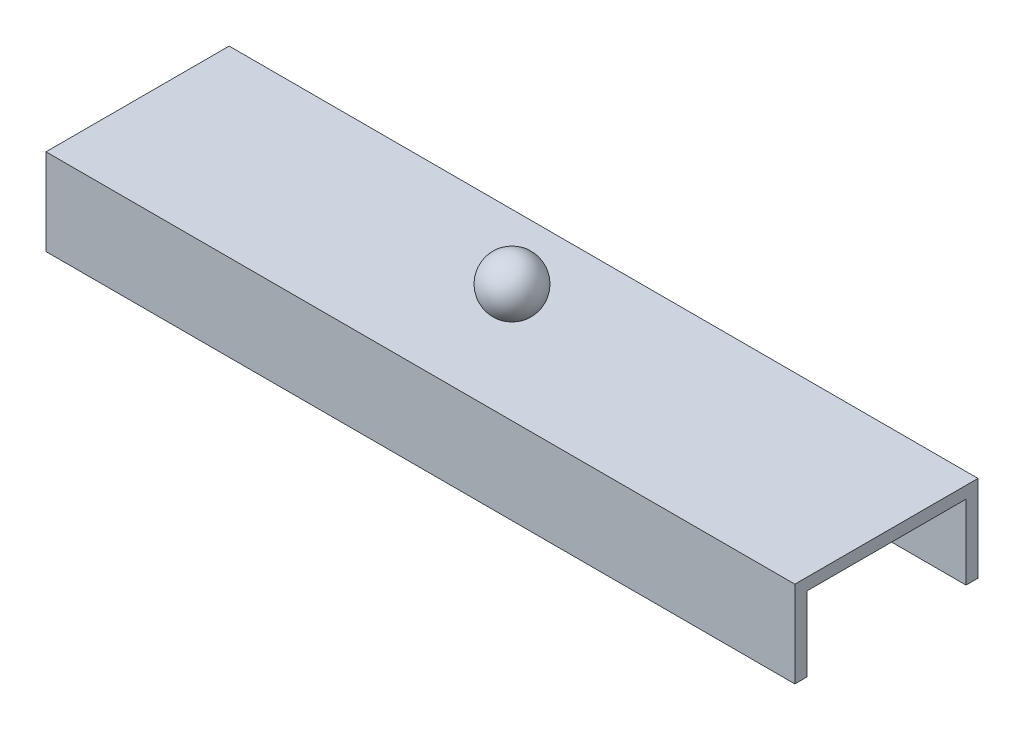
ISO-10303-21;
HEADER;
FILE_DESCRIPTION(('STEP AP214'),'2;1');
FILE_NAME('part.step','',(''),(''),'','','');
FILE_SCHEMA(('AUTOMOTIVE_DESIGN { 1 0 10303 214 1 1 1 1 }'));
ENDSEC;
DATA;
#1=APPLICATION_CONTEXT('core data for automotive mechanical design processes');
#2=APPLICATION_PROTOCOL_DEFINITION('international standard','automotive_design',2000,#1);
#3=PRODUCT_CONTEXT('',#1,'mechanical');
#4=PRODUCT('Part','Part','',(#3));
#5=PRODUCT_RELATED_PRODUCT_CATEGORY('part','',(#4));
#6=PRODUCT_DEFINITION_FORMATION('','',#4);
#7=PRODUCT_DEFINITION_CONTEXT('part definition',#1,'design');
#8=PRODUCT_DEFINITION('design','',#6,#7);
#9=PRODUCT_DEFINITION_SHAPE('','',#8);
#10=(LENGTH_UNIT() NAMED_UNIT(*) SI_UNIT(.MILLI.,.METRE.));
#11=(NAMED_UNIT(*) PLANE_ANGLE_UNIT() SI_UNIT($,.RADIAN.));
#12=(NAMED_UNIT(*) SI_UNIT($,.STERADIAN.) SOLID_ANGLE_UNIT());
#13=UNCERTAINTY_MEASURE_WITH_UNIT(LENGTH_MEASURE(1.E-05),#10,'distance_accuracy_value','');
#14=(GEOMETRIC_REPRESENTATION_CONTEXT(3) GLOBAL_UNCERTAINTY_ASSIGNED_CONTEXT((#13)) GLOBAL_UNIT_ASSIGNED_CONTEXT((#10,
#11,#12)) REPRESENTATION_CONTEXT('',''));
#15=CARTESIAN_POINT('',(0.,0.,0.));
#16=DIRECTION('',(0.,0.,1.));
#17=DIRECTION('',(1.,0.,0.));
#18=AXIS2_PLACEMENT_3D('',#15,#16,#17);
#19=CARTESIAN_POINT('',(-62.6,-2.,-13.31));
#20=DIRECTION('',(-1.,0.,0.));
#21=DIRECTION('',(0.,0.,1.));
#22=AXIS2_PLACEMENT_3D('',#19,#20,#21);
#23=PLANE('',#22);
#24=DIRECTION('',(0.,0.,1.));
#25=VECTOR('',#24,1.);
#26=CARTESIAN_POINT('',(-62.6,0.,-13.31));
#27=LINE('',#26,#25);
#28=CARTESIAN_POINT('',(-62.6,0.,-15.31));
#29=VERTEX_POINT('',#28);
#30=CARTESIAN_POINT('',(-62.6,0.,15.31));
#31=VERTEX_POINT('',#30);
#32=EDGE_CURVE('E127',#29,#31,#27,.T.);
#33=ORIENTED_EDGE('',*,*,#32,.F.);
#34=DIRECTION('',(0.,1.,0.));
#35=VECTOR('',#34,1.);
#36=CARTESIAN_POINT('',(-62.6,-2.,-15.31));
#37=LINE('',#36,#35);
#38=CARTESIAN_POINT('',(-62.6,-14.45,-15.31));
#39=VERTEX_POINT('',#38);
#40=EDGE_CURVE('E116',#39,#29,#37,.T.);
#41=ORIENTED_EDGE('',*,*,#40,.F.);
#42=DIRECTION('',(0.,0.,1.));
#43=VECTOR('',#42,1.);
#44=CARTESIAN_POINT('',(-62.6,-14.45,-15.31));
#45=LINE('',#44,#43);
#46=CARTESIAN_POINT('',(-62.6,-14.45,-13.31));
#47=VERTEX_POINT('',#46);
#48=EDGE_CURVE('E122',#39,#47,#45,.T.);
#49=ORIENTED_EDGE('',*,*,#48,.T.);
#50=DIRECTION('',(0.,1.,0.));
#51=VECTOR('',#50,1.);
#52=CARTESIAN_POINT('',(-62.6,-2.,-13.31));
#53=LINE('',#52,#51);
#54=CARTESIAN_POINT('',(-62.6,-2.,-13.31));
#55=VERTEX_POINT('',#54);
#56=EDGE_CURVE('E210',#47,#55,#53,.T.);
#57=ORIENTED_EDGE('',*,*,#56,.T.);
#58=DIRECTION('',(0.,0.,1.));
#59=VECTOR('',#58,1.);
#60=CARTESIAN_POINT('',(-62.6,-2.,-13.31));
#61=LINE('',#60,#59);
#62=CARTESIAN_POINT('',(-62.6,-2.,13.31));
#63=VERTEX_POINT('',#62);
#64=EDGE_CURVE('E190',#55,#63,#61,.T.);
#65=ORIENTED_EDGE('',*,*,#64,.T.);
#66=DIRECTION('',(0.,1.,0.));
#67=VECTOR('',#66,1.);
#68=CARTESIAN_POINT('',(-62.6,-2.,13.31));
#69=LINE('',#68,#67);
#70=CARTESIAN_POINT('',(-62.6,-14.45,13.31));
#71=VERTEX_POINT('',#70);
#72=EDGE_CURVE('E152',#71,#63,#69,.T.);
#73=ORIENTED_EDGE('',*,*,#72,.F.);
#74=DIRECTION('',(0.,0.,-1.));
#75=VECTOR('',#74,1.);
#76=CARTESIAN_POINT('',(-62.6,-14.45,15.31));
#77=LINE('',#76,#75);
#78=CARTESIAN_POINT('',(-62.6,-14.45,15.31));
#79=VERTEX_POINT('',#78);
#80=EDGE_CURVE('E171',#79,#71,#77,.T.);
#81=ORIENTED_EDGE('',*,*,#80,.F.);
#82=DIRECTION('',(0.,1.,0.));
#83=VECTOR('',#82,1.);
#84=CARTESIAN_POINT('',(-62.6,-2.,15.31));
#85=LINE('',#84,#83);
#86=EDGE_CURVE('E162',#79,#31,#85,.T.);
#87=ORIENTED_EDGE('',*,*,#86,.T.);
#88=EDGE_LOOP('',(#33,#41,#49,#57,#65,#73,#81,#87));
#89=FACE_BOUND('',#88,.T.);
#90=ADVANCED_FACE('F52',(#89),#23,.T.);
#91=CARTESIAN_POINT('',(62.6,-2.,-13.31));
#92=DIRECTION('',(1.,0.,0.));
#93=DIRECTION('',(0.,0.,-1.));
#94=AXIS2_PLACEMENT_3D('',#91,#92,#93);
#95=PLANE('',#94);
#96=DIRECTION('',(0.,0.,-1.));
#97=VECTOR('',#96,1.);
#98=CARTESIAN_POINT('',(62.6,0.,-13.31));
#99=LINE('',#98,#97);
#100=CARTESIAN_POINT('',(62.6,0.,15.31));
#101=VERTEX_POINT('',#100);
#102=CARTESIAN_POINT('',(62.6,0.,-15.31));
#103=VERTEX_POINT('',#102);
#104=EDGE_CURVE('E57',#101,#103,#99,.T.);
#105=ORIENTED_EDGE('',*,*,#104,.F.);
#106=DIRECTION('',(0.,-1.,0.));
#107=VECTOR('',#106,1.);
#108=CARTESIAN_POINT('',(62.6,-2.,15.31));
#109=LINE('',#108,#107);
#110=CARTESIAN_POINT('',(62.6,-14.45,15.31));
#111=VERTEX_POINT('',#110);
#112=EDGE_CURVE('E172',#101,#111,#109,.T.);
#113=ORIENTED_EDGE('',*,*,#112,.T.);
#114=DIRECTION('',(0.,0.,-1.));
#115=VECTOR('',#114,1.);
#116=CARTESIAN_POINT('',(62.6,-14.45,15.31));
#117=LINE('',#116,#115);
#118=CARTESIAN_POINT('',(62.6,-14.45,13.31));
#119=VERTEX_POINT('',#118);
#120=EDGE_CURVE('E182',#111,#119,#117,.T.);
#121=ORIENTED_EDGE('',*,*,#120,.T.);
#122=DIRECTION('',(0.,-1.,0.));
#123=VECTOR('',#122,1.);
#124=CARTESIAN_POINT('',(62.6,-2.,13.31));
#125=LINE('',#124,#123);
#126=CARTESIAN_POINT('',(62.6,-2.,13.31));
#127=VERTEX_POINT('',#126);
#128=EDGE_CURVE('E163',#127,#119,#125,.T.);
#129=ORIENTED_EDGE('',*,*,#128,.F.);
#130=DIRECTION('',(0.,0.,-1.));
#131=VECTOR('',#130,1.);
#132=CARTESIAN_POINT('',(62.6,-2.,-13.31));
#133=LINE('',#132,#131);
#134=CARTESIAN_POINT('',(62.6,-2.,-13.31));
#135=VERTEX_POINT('',#134);
#136=EDGE_CURVE('E65',#127,#135,#133,.T.);
#137=ORIENTED_EDGE('',*,*,#136,.T.);
#138=DIRECTION('',(0.,-1.,0.));
#139=VECTOR('',#138,1.);
#140=CARTESIAN_POINT('',(62.6,-2.,-13.31));
#141=LINE('',#140,#139);
#142=CARTESIAN_POINT('',(62.6,-14.45,-13.31));
#143=VERTEX_POINT('',#142);
#144=EDGE_CURVE('E142',#135,#143,#141,.T.);
#145=ORIENTED_EDGE('',*,*,#144,.T.);
#146=DIRECTION('',(0.,0.,1.));
#147=VECTOR('',#146,1.);
#148=CARTESIAN_POINT('',(62.6,-14.45,-15.31));
#149=LINE('',#148,#147);
#150=CARTESIAN_POINT('',(62.6,-14.45,-15.31));
#151=VERTEX_POINT('',#150);
#152=EDGE_CURVE('E149',#151,#143,#149,.T.);
#153=ORIENTED_EDGE('',*,*,#152,.F.);
#154=DIRECTION('',(0.,-1.,0.));
#155=VECTOR('',#154,1.);
#156=CARTESIAN_POINT('',(62.6,-2.,-15.31));
#157=LINE('',#156,#155);
#158=EDGE_CURVE('E139',#103,#151,#157,.T.);
#159=ORIENTED_EDGE('',*,*,#158,.F.);
#160=EDGE_LOOP('',(#105,#113,#121,#129,#137,#145,#153,#159));
#161=FACE_BOUND('',#160,.T.);
#162=ADVANCED_FACE('F203',(#161),#95,.T.);
#163=CARTESIAN_POINT('',(0.,-2.,0.));
#164=DIRECTION('',(0.,1.,0.));
#165=DIRECTION('',(0.,0.,1.));
#166=AXIS2_PLACEMENT_3D('',#163,#164,#165);
#167=PLANE('',#166);
#168=ORIENTED_EDGE('',*,*,#64,.F.);
#169=DIRECTION('',(-1.,0.,0.));
#170=VECTOR('',#169,1.);
#171=CARTESIAN_POINT('',(-62.6,-2.,-13.31));
#172=LINE('',#171,#170);
#173=EDGE_CURVE('E12',#135,#55,#172,.T.);
#174=ORIENTED_EDGE('',*,*,#173,.F.);
#175=ORIENTED_EDGE('',*,*,#136,.F.);
#176=DIRECTION('',(1.,0.,0.));
#177=VECTOR('',#176,1.);
#178=CARTESIAN_POINT('',(-62.6,-2.,13.31));
#179=LINE('',#178,#177);
#180=EDGE_CURVE('E77',#63,#127,#179,.T.);
#181=ORIENTED_EDGE('',*,*,#180,.F.);
#182=EDGE_LOOP('',(#168,#174,#175,#181));
#183=FACE_BOUND('',#182,.T.);
#184=ADVANCED_FACE('F237',(#183),#167,.F.);
#185=CARTESIAN_POINT('',(0.,0.,0.));
#186=DIRECTION('',(0.,1.,0.));
#187=DIRECTION('',(0.,0.,1.));
#188=AXIS2_PLACEMENT_3D('',#185,#186,#187);
#189=PLANE('',#188);
#190=ORIENTED_EDGE('',*,*,#32,.T.);
#191=DIRECTION('',(1.,0.,0.));
#192=VECTOR('',#191,1.);
#193=CARTESIAN_POINT('',(-62.6,0.,15.31));
#194=LINE('',#193,#192);
#195=EDGE_CURVE('E170',#31,#101,#194,.T.);
#196=ORIENTED_EDGE('',*,*,#195,.T.);
#197=ORIENTED_EDGE('',*,*,#104,.T.);
#198=DIRECTION('',(1.,0.,0.));
#199=VECTOR('',#198,1.);
#200=CARTESIAN_POINT('',(-62.6,0.,-15.31));
#201=LINE('',#200,#199);
#202=EDGE_CURVE('E132',#29,#103,#201,.T.);
#203=ORIENTED_EDGE('',*,*,#202,.F.);
#204=EDGE_LOOP('',(#190,#196,#197,#203));
#205=FACE_BOUND('',#204,.T.);
#206=ADVANCED_FACE('F197',(#205),#189,.T.);
#207=CARTESIAN_POINT('',(-62.6,-14.45,15.31));
#208=DIRECTION('',(0.,-1.,0.));
#209=DIRECTION('',(0.,0.,-1.));
#210=AXIS2_PLACEMENT_3D('',#207,#208,#209);
#211=PLANE('',#210);
#212=DIRECTION('',(-1.,0.,0.));
#213=VECTOR('',#212,1.);
#214=CARTESIAN_POINT('',(-62.6,-14.45,13.31));
#215=LINE('',#214,#213);
#216=EDGE_CURVE('E146',#119,#71,#215,.T.);
#217=ORIENTED_EDGE('',*,*,#216,.F.);
#218=ORIENTED_EDGE('',*,*,#120,.F.);
#219=DIRECTION('',(-1.,0.,0.));
#220=VECTOR('',#219,1.);
#221=CARTESIAN_POINT('',(-62.6,-14.45,15.31));
#222=LINE('',#221,#220);
#223=EDGE_CURVE('E157',#111,#79,#222,.T.);
#224=ORIENTED_EDGE('',*,*,#223,.T.);
#225=ORIENTED_EDGE('',*,*,#80,.T.);
#226=EDGE_LOOP('',(#217,#218,#224,#225));
#227=FACE_BOUND('',#226,.T.);
#228=ADVANCED_FACE('F217',(#227),#211,.T.);
#229=CARTESIAN_POINT('',(0.,0.,15.31));
#230=DIRECTION('',(0.,0.,-1.));
#231=DIRECTION('',(-1.,0.,0.));
#232=AXIS2_PLACEMENT_3D('',#229,#230,#231);
#233=PLANE('',#232);
#234=ORIENTED_EDGE('',*,*,#223,.F.);
#235=ORIENTED_EDGE('',*,*,#112,.F.);
#236=ORIENTED_EDGE('',*,*,#195,.F.);
#237=ORIENTED_EDGE('',*,*,#86,.F.);
#238=EDGE_LOOP('',(#234,#235,#236,#237));
#239=FACE_BOUND('',#238,.T.);
#240=ADVANCED_FACE('F225',(#239),#233,.F.);
#241=CARTESIAN_POINT('',(0.,0.,13.31));
#242=DIRECTION('',(0.,0.,-1.));
#243=DIRECTION('',(-1.,0.,0.));
#244=AXIS2_PLACEMENT_3D('',#241,#242,#243);
#245=PLANE('',#244);
#246=ORIENTED_EDGE('',*,*,#72,.T.);
#247=ORIENTED_EDGE('',*,*,#180,.T.);
#248=ORIENTED_EDGE('',*,*,#128,.T.);
#249=ORIENTED_EDGE('',*,*,#216,.T.);
#250=EDGE_LOOP('',(#246,#247,#248,#249));
#251=FACE_BOUND('',#250,.T.);
#252=ADVANCED_FACE('F214',(#251),#245,.T.);
#253=CARTESIAN_POINT('',(0.,0.,-13.31));
#254=DIRECTION('',(0.,0.,-1.));
#255=DIRECTION('',(-1.,0.,0.));
#256=AXIS2_PLACEMENT_3D('',#253,#254,#255);
#257=PLANE('',#256);
#258=ORIENTED_EDGE('',*,*,#144,.F.);
#259=ORIENTED_EDGE('',*,*,#173,.T.);
#260=ORIENTED_EDGE('',*,*,#56,.F.);
#261=DIRECTION('',(-1.,0.,0.));
#262=VECTOR('',#261,1.);
#263=CARTESIAN_POINT('',(-62.6,-14.45,-13.31));
#264=LINE('',#263,#262);
#265=EDGE_CURVE('E148',#143,#47,#264,.T.);
#266=ORIENTED_EDGE('',*,*,#265,.F.);
#267=EDGE_LOOP('',(#258,#259,#260,#266));
#268=FACE_BOUND('',#267,.T.);
#269=ADVANCED_FACE('F215',(#268),#257,.F.);
#270=CARTESIAN_POINT('',(-62.6,-14.45,-15.31));
#271=DIRECTION('',(0.,1.,0.));
#272=DIRECTION('',(0.,0.,1.));
#273=AXIS2_PLACEMENT_3D('',#270,#271,#272);
#274=PLANE('',#273);
#275=ORIENTED_EDGE('',*,*,#265,.T.);
#276=ORIENTED_EDGE('',*,*,#48,.F.);
#277=DIRECTION('',(-1.,0.,0.));
#278=VECTOR('',#277,1.);
#279=CARTESIAN_POINT('',(-62.6,-14.45,-15.31));
#280=LINE('',#279,#278);
#281=EDGE_CURVE('E135',#151,#39,#280,.T.);
#282=ORIENTED_EDGE('',*,*,#281,.F.);
#283=ORIENTED_EDGE('',*,*,#152,.T.);
#284=EDGE_LOOP('',(#275,#276,#282,#283));
#285=FACE_BOUND('',#284,.T.);
#286=ADVANCED_FACE('F145',(#285),#274,.F.);
#287=CARTESIAN_POINT('',(0.,0.,-15.31));
#288=DIRECTION('',(0.,0.,-1.));
#289=DIRECTION('',(-1.,0.,0.));
#290=AXIS2_PLACEMENT_3D('',#287,#288,#289);
#291=PLANE('',#290);
#292=ORIENTED_EDGE('',*,*,#281,.T.);
#293=ORIENTED_EDGE('',*,*,#40,.T.);
#294=ORIENTED_EDGE('',*,*,#202,.T.);
#295=ORIENTED_EDGE('',*,*,#158,.T.);
#296=EDGE_LOOP('',(#292,#293,#294,#295));
#297=FACE_BOUND('',#296,.T.);
#298=ADVANCED_FACE('F133',(#297),#291,.T.);
#299=CLOSED_SHELL('',(#90,#162,#184,#206,#228,#240,#252,#269,#286,#298));
#300=MANIFOLD_SOLID_BREP('B2',#299);
#301=CARTESIAN_POINT('',(0.,4.5,0.));
#302=DIRECTION('',(0.,-1.,0.));
#303=DIRECTION('',(-1.,0.,0.));
#304=AXIS2_PLACEMENT_3D('',#301,#302,#303);
#305=SPHERICAL_SURFACE('',#304,4.5);
#306=CARTESIAN_POINT('',(0.,0.,0.));
#307=VERTEX_POINT('',#306);
#308=VERTEX_LOOP('',#307);
#309=FACE_BOUND('',#308,.T.);
#310=ADVANCED_FACE('F323',(#309),#305,.T.);
#311=CLOSED_SHELL('',(#310));
#312=MANIFOLD_SOLID_BREP('B6',#311);
#313=ADVANCED_BREP_SHAPE_REPRESENTATION('',(#18,#300,#312),#14);
#314=SHAPE_DEFINITION_REPRESENTATION(#9,#313);
ENDSEC;
END-ISO-10303-21;
